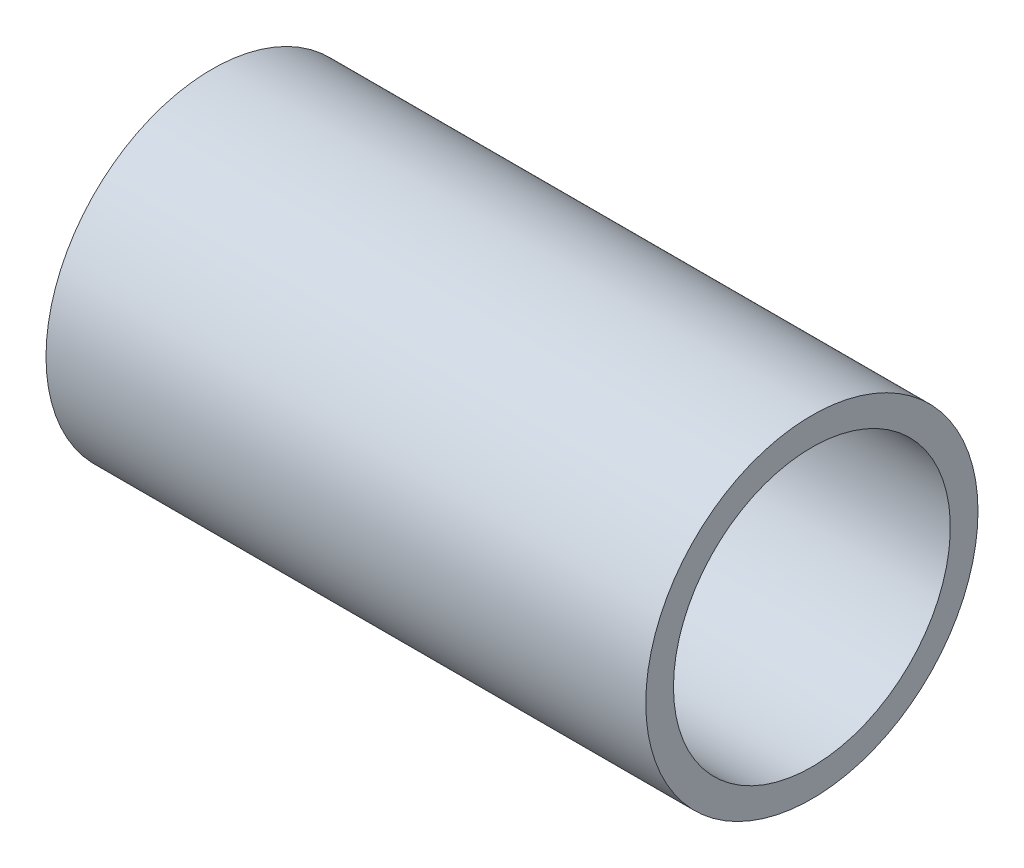
ISO-10303-21;
HEADER;
FILE_DESCRIPTION(('STEP AP214'),'2;1');
FILE_NAME('part.step','',(''),(''),'','','');
FILE_SCHEMA(('AUTOMOTIVE_DESIGN { 1 0 10303 214 1 1 1 1 }'));
ENDSEC;
DATA;
#1=APPLICATION_CONTEXT('core data for automotive mechanical design processes');
#2=APPLICATION_PROTOCOL_DEFINITION('international standard','automotive_design',2000,#1);
#3=PRODUCT_CONTEXT('',#1,'mechanical');
#4=PRODUCT('Part','Part','',(#3));
#5=PRODUCT_RELATED_PRODUCT_CATEGORY('part','',(#4));
#6=PRODUCT_DEFINITION_FORMATION('','',#4);
#7=PRODUCT_DEFINITION_CONTEXT('part definition',#1,'design');
#8=PRODUCT_DEFINITION('design','',#6,#7);
#9=PRODUCT_DEFINITION_SHAPE('','',#8);
#10=(LENGTH_UNIT() NAMED_UNIT(*) SI_UNIT(.MILLI.,.METRE.));
#11=(NAMED_UNIT(*) PLANE_ANGLE_UNIT() SI_UNIT($,.RADIAN.));
#12=(NAMED_UNIT(*) SI_UNIT($,.STERADIAN.) SOLID_ANGLE_UNIT());
#13=UNCERTAINTY_MEASURE_WITH_UNIT(LENGTH_MEASURE(1.E-05),#10,'distance_accuracy_value','');
#14=(GEOMETRIC_REPRESENTATION_CONTEXT(3) GLOBAL_UNCERTAINTY_ASSIGNED_CONTEXT((#13)) GLOBAL_UNIT_ASSIGNED_CONTEXT((#10,
#11,#12)) REPRESENTATION_CONTEXT('',''));
#15=CARTESIAN_POINT('',(0.,0.,0.));
#16=DIRECTION('',(0.,0.,1.));
#17=DIRECTION('',(1.,0.,0.));
#18=AXIS2_PLACEMENT_3D('',#15,#16,#17);
#19=CARTESIAN_POINT('',(17.1958,0.,0.));
#20=DIRECTION('',(-1.,0.,0.));
#21=DIRECTION('',(0.,0.,1.));
#22=AXIS2_PLACEMENT_3D('',#19,#20,#21);
#23=CYLINDRICAL_SURFACE('',#22,7.9375);
#24=CARTESIAN_POINT('',(-17.1958,0.,0.));
#25=DIRECTION('',(-1.,0.,0.));
#26=DIRECTION('',(0.,0.,1.));
#27=AXIS2_PLACEMENT_3D('',#24,#25,#26);
#28=CIRCLE('',#27,7.9375);
#29=CARTESIAN_POINT('',(-17.1958,0.,7.9375));
#30=VERTEX_POINT('',#29);
#31=EDGE_CURVE('E27',#30,#30,#28,.T.);
#32=ORIENTED_EDGE('',*,*,#31,.T.);
#33=EDGE_LOOP('',(#32));
#34=FACE_BOUND('',#33,.T.);
#35=CARTESIAN_POINT('',(17.1958,0.,0.));
#36=DIRECTION('',(-1.,0.,0.));
#37=DIRECTION('',(0.,0.,1.));
#38=AXIS2_PLACEMENT_3D('',#35,#36,#37);
#39=CIRCLE('',#38,7.9375);
#40=CARTESIAN_POINT('',(17.1958,0.,7.9375));
#41=VERTEX_POINT('',#40);
#42=EDGE_CURVE('E18',#41,#41,#39,.T.);
#43=ORIENTED_EDGE('',*,*,#42,.F.);
#44=EDGE_LOOP('',(#43));
#45=FACE_BOUND('',#44,.T.);
#46=ADVANCED_FACE('F15',(#34,#45),#23,.F.);
#47=CARTESIAN_POINT('',(17.1958,0.,0.));
#48=DIRECTION('',(1.,0.,0.));
#49=DIRECTION('',(0.,0.,-1.));
#50=AXIS2_PLACEMENT_3D('',#47,#48,#49);
#51=PLANE('',#50);
#52=ORIENTED_EDGE('',*,*,#42,.T.);
#53=EDGE_LOOP('',(#52));
#54=FACE_BOUND('',#53,.T.);
#55=CARTESIAN_POINT('',(17.1958,0.,0.));
#56=DIRECTION('',(-1.,0.,0.));
#57=DIRECTION('',(0.,0.,1.));
#58=AXIS2_PLACEMENT_3D('',#55,#56,#57);
#59=CIRCLE('',#58,9.525);
#60=CARTESIAN_POINT('',(17.1958,0.,9.525));
#61=VERTEX_POINT('',#60);
#62=EDGE_CURVE('E22',#61,#61,#59,.T.);
#63=ORIENTED_EDGE('',*,*,#62,.F.);
#64=EDGE_LOOP('',(#63));
#65=FACE_BOUND('',#64,.T.);
#66=ADVANCED_FACE('F35',(#54,#65),#51,.T.);
#67=CARTESIAN_POINT('',(-17.1958,0.,0.));
#68=DIRECTION('',(1.,0.,0.));
#69=DIRECTION('',(0.,0.,-1.));
#70=AXIS2_PLACEMENT_3D('',#67,#68,#69);
#71=PLANE('',#70);
#72=ORIENTED_EDGE('',*,*,#31,.F.);
#73=EDGE_LOOP('',(#72));
#74=FACE_BOUND('',#73,.T.);
#75=CARTESIAN_POINT('',(-17.1958,0.,0.));
#76=DIRECTION('',(-1.,0.,0.));
#77=DIRECTION('',(0.,0.,1.));
#78=AXIS2_PLACEMENT_3D('',#75,#76,#77);
#79=CIRCLE('',#78,9.525);
#80=CARTESIAN_POINT('',(-17.1958,0.,9.525));
#81=VERTEX_POINT('',#80);
#82=EDGE_CURVE('E10',#81,#81,#79,.F.);
#83=ORIENTED_EDGE('',*,*,#82,.F.);
#84=EDGE_LOOP('',(#83));
#85=FACE_BOUND('',#84,.T.);
#86=ADVANCED_FACE('F43',(#74,#85),#71,.F.);
#87=CARTESIAN_POINT('',(17.1958,0.,0.));
#88=DIRECTION('',(-1.,0.,0.));
#89=DIRECTION('',(0.,0.,1.));
#90=AXIS2_PLACEMENT_3D('',#87,#88,#89);
#91=CYLINDRICAL_SURFACE('',#90,9.525);
#92=ORIENTED_EDGE('',*,*,#82,.T.);
#93=EDGE_LOOP('',(#92));
#94=FACE_BOUND('',#93,.T.);
#95=ORIENTED_EDGE('',*,*,#62,.T.);
#96=EDGE_LOOP('',(#95));
#97=FACE_BOUND('',#96,.T.);
#98=ADVANCED_FACE('F44',(#94,#97),#91,.T.);
#99=CLOSED_SHELL('',(#46,#66,#86,#98));
#100=MANIFOLD_SOLID_BREP('B1',#99);
#101=ADVANCED_BREP_SHAPE_REPRESENTATION('',(#18,#100),#14);
#102=SHAPE_DEFINITION_REPRESENTATION(#9,#101);
ENDSEC;
END-ISO-10303-21;
